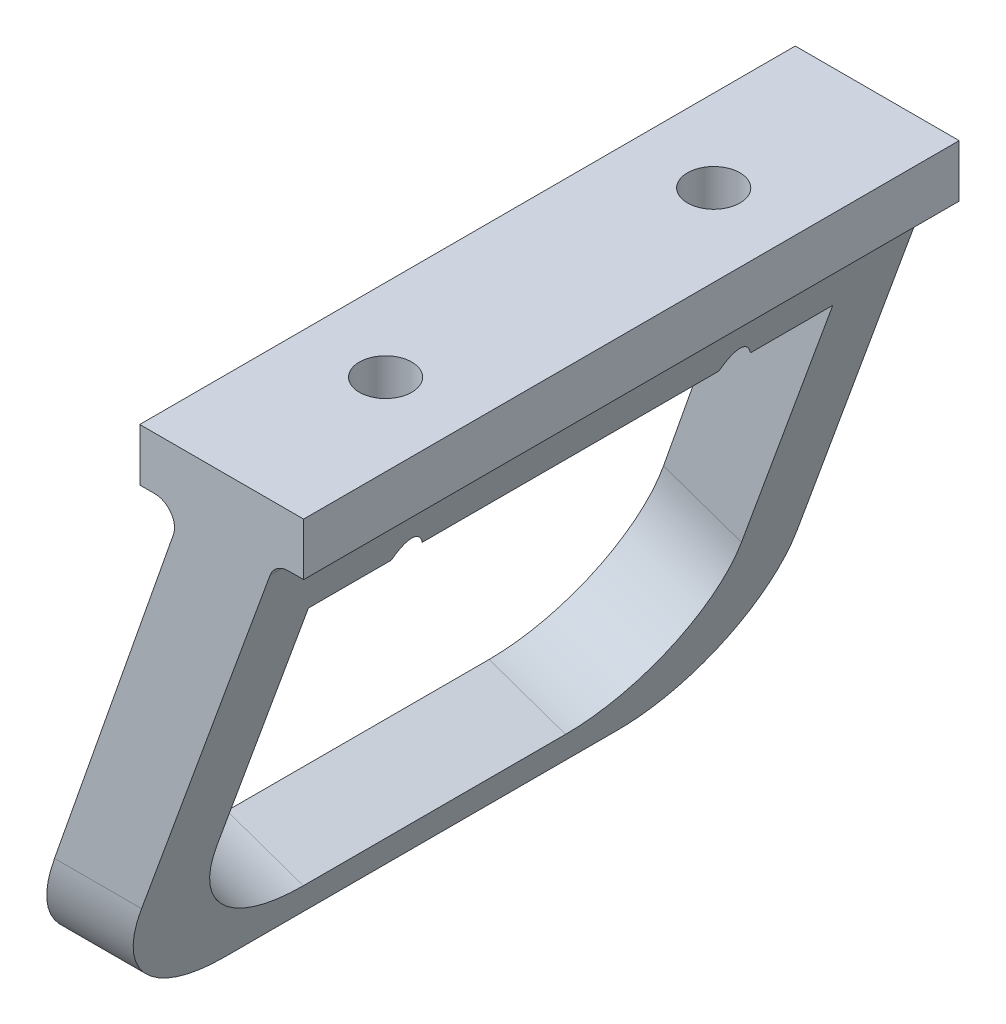
ISO-10303-21;
HEADER;
FILE_DESCRIPTION(('STEP AP214'),'2;1');
FILE_NAME('part.step','',(''),(''),'','','');
FILE_SCHEMA(('AUTOMOTIVE_DESIGN { 1 0 10303 214 1 1 1 1 }'));
ENDSEC;
DATA;
#1=APPLICATION_CONTEXT('core data for automotive mechanical design processes');
#2=APPLICATION_PROTOCOL_DEFINITION('international standard','automotive_design',2000,#1);
#3=PRODUCT_CONTEXT('',#1,'mechanical');
#4=PRODUCT('Part','Part','',(#3));
#5=PRODUCT_RELATED_PRODUCT_CATEGORY('part','',(#4));
#6=PRODUCT_DEFINITION_FORMATION('','',#4);
#7=PRODUCT_DEFINITION_CONTEXT('part definition',#1,'design');
#8=PRODUCT_DEFINITION('design','',#6,#7);
#9=PRODUCT_DEFINITION_SHAPE('','',#8);
#10=(LENGTH_UNIT() NAMED_UNIT(*) SI_UNIT(.MILLI.,.METRE.));
#11=(NAMED_UNIT(*) PLANE_ANGLE_UNIT() SI_UNIT($,.RADIAN.));
#12=(NAMED_UNIT(*) SI_UNIT($,.STERADIAN.) SOLID_ANGLE_UNIT());
#13=UNCERTAINTY_MEASURE_WITH_UNIT(LENGTH_MEASURE(1.E-05),#10,'distance_accuracy_value','');
#14=(GEOMETRIC_REPRESENTATION_CONTEXT(3) GLOBAL_UNCERTAINTY_ASSIGNED_CONTEXT((#13)) GLOBAL_UNIT_ASSIGNED_CONTEXT((#10,
#11,#12)) REPRESENTATION_CONTEXT('',''));
#15=CARTESIAN_POINT('',(0.,0.,0.));
#16=DIRECTION('',(0.,0.,1.));
#17=DIRECTION('',(1.,0.,0.));
#18=AXIS2_PLACEMENT_3D('',#15,#16,#17);
#19=CARTESIAN_POINT('',(-20.,-75.8286661573129,-100.));
#20=DIRECTION('',(0.943905830464153,-0.330214753177047,0.));
#21=DIRECTION('',(0.330214753177047,0.943905830464153,0.));
#22=AXIS2_PLACEMENT_3D('',#19,#20,#21);
#23=PLANE('',#22);
#24=DIRECTION('',(0.,0.,1.));
#25=VECTOR('',#24,1.);
#26=CARTESIAN_POINT('',(-20.,-75.8286661573129,-100.));
#27=LINE('',#26,#25);
#28=CARTESIAN_POINT('',(-20.,-75.8286661573129,-80.));
#29=VERTEX_POINT('',#28);
#30=CARTESIAN_POINT('',(-20.,-75.8286661573129,-20.));
#31=VERTEX_POINT('',#30);
#32=EDGE_CURVE('E264',#29,#31,#27,.T.);
#33=ORIENTED_EDGE('',*,*,#32,.T.);
#34=CARTESIAN_POINT('',(-13.003226751663,-55.8286661573129,-20.));
#35=DIRECTION('',(0.943905830464153,-0.330214753177047,0.));
#36=DIRECTION('',(0.330214753177047,0.943905830464153,0.));
#37=AXIS2_PLACEMENT_3D('',#34,#35,#36);
#38=ELLIPSE('',#37,21.1885543605184,20.);
#39=CARTESIAN_POINT('',(-13.003226751663,-55.8286661573129,0.));
#40=VERTEX_POINT('',#39);
#41=EDGE_CURVE('E281',#31,#40,#38,.F.);
#42=ORIENTED_EDGE('',*,*,#41,.T.);
#43=DIRECTION('',(0.330214753177047,0.943905830464153,0.));
#44=VECTOR('',#43,1.);
#45=CARTESIAN_POINT('',(-20.,-75.8286661573129,0.));
#46=LINE('',#45,#44);
#47=CARTESIAN_POINT('',(5.13171749139246,-3.99064425953114,0.));
#48=VERTEX_POINT('',#47);
#49=EDGE_CURVE('E235',#40,#48,#46,.T.);
#50=ORIENTED_EDGE('',*,*,#49,.T.);
#51=DIRECTION('',(0.,0.,1.));
#52=VECTOR('',#51,1.);
#53=CARTESIAN_POINT('',(5.13171749139246,-3.99064425953114,-100.));
#54=LINE('',#53,#52);
#55=CARTESIAN_POINT('',(5.13171749139246,-3.99064425953114,-100.));
#56=VERTEX_POINT('',#55);
#57=EDGE_CURVE('E265',#56,#48,#54,.T.);
#58=ORIENTED_EDGE('',*,*,#57,.F.);
#59=DIRECTION('',(0.330214753177047,0.943905830464153,0.));
#60=VECTOR('',#59,1.);
#61=CARTESIAN_POINT('',(-20.,-75.8286661573129,-100.));
#62=LINE('',#61,#60);
#63=CARTESIAN_POINT('',(-13.003226751663,-55.8286661573129,-100.));
#64=VERTEX_POINT('',#63);
#65=EDGE_CURVE('E214',#64,#56,#62,.T.);
#66=ORIENTED_EDGE('',*,*,#65,.F.);
#67=CARTESIAN_POINT('',(-13.003226751663,-55.8286661573129,-80.));
#68=DIRECTION('',(0.943905830464153,-0.330214753177047,0.));
#69=DIRECTION('',(-0.330214753177047,-0.943905830464153,0.));
#70=AXIS2_PLACEMENT_3D('',#67,#68,#69);
#71=ELLIPSE('',#70,21.1885543605184,20.);
#72=EDGE_CURVE('E276',#64,#29,#71,.F.);
#73=ORIENTED_EDGE('',*,*,#72,.T.);
#74=EDGE_LOOP('',(#33,#42,#50,#58,#66,#73));
#75=FACE_BOUND('',#74,.T.);
#76=CARTESIAN_POINT('',(-10.0935574046886,-47.5114912433883,-70.));
#77=DIRECTION('',(-0.943905830464153,0.330214753177047,0.));
#78=DIRECTION('',(-0.330214753177047,-0.943905830464153,0.));
#79=AXIS2_PLACEMENT_3D('',#76,#77,#78);
#80=CIRCLE('',#79,20.);
#81=CARTESIAN_POINT('',(-10.0935574046885,-47.5114912433882,-90.));
#82=VERTEX_POINT('',#81);
#83=CARTESIAN_POINT('',(-16.6978524682295,-66.3896078526714,-69.9999999999998));
#84=VERTEX_POINT('',#83);
#85=EDGE_CURVE('E296',#82,#84,#80,.T.);
#86=ORIENTED_EDGE('',*,*,#85,.F.);
#87=DIRECTION('',(-0.330214753177047,-0.943905830464153,0.));
#88=VECTOR('',#87,1.);
#89=CARTESIAN_POINT('',(3.35630803146053,-9.06558208277391,-90.));
#90=LINE('',#89,#88);
#91=CARTESIAN_POINT('',(3.35630803146053,-9.06558208277391,-90.));
#92=VERTEX_POINT('',#91);
#93=EDGE_CURVE('E291',#92,#82,#90,.T.);
#94=ORIENTED_EDGE('',*,*,#93,.F.);
#95=DIRECTION('',(0.,0.,-1.));
#96=VECTOR('',#95,1.);
#97=CARTESIAN_POINT('',(3.35630803146053,-9.06558208277391,-90.));
#98=LINE('',#97,#96);
#99=CARTESIAN_POINT('',(3.35630803146053,-9.06558208277391,-10.));
#100=VERTEX_POINT('',#99);
#101=EDGE_CURVE('E313',#100,#92,#98,.T.);
#102=ORIENTED_EDGE('',*,*,#101,.F.);
#103=DIRECTION('',(0.330214753177047,0.943905830464153,0.));
#104=VECTOR('',#103,1.);
#105=CARTESIAN_POINT('',(3.35630803146053,-9.06558208277391,-10.));
#106=LINE('',#105,#104);
#107=CARTESIAN_POINT('',(-10.0935574046885,-47.5114912433882,-9.99999999999999));
#108=VERTEX_POINT('',#107);
#109=EDGE_CURVE('E306',#108,#100,#106,.T.);
#110=ORIENTED_EDGE('',*,*,#109,.F.);
#111=CARTESIAN_POINT('',(-10.0935574046886,-47.5114912433883,-30.));
#112=DIRECTION('',(-0.943905830464153,0.330214753177047,0.));
#113=DIRECTION('',(-0.330214753177047,-0.943905830464153,0.));
#114=AXIS2_PLACEMENT_3D('',#111,#112,#113);
#115=CIRCLE('',#114,20.);
#116=CARTESIAN_POINT('',(-16.6978524682295,-66.3896078526714,-30.0000000000001));
#117=VERTEX_POINT('',#116);
#118=EDGE_CURVE('E304',#117,#108,#115,.T.);
#119=ORIENTED_EDGE('',*,*,#118,.F.);
#120=DIRECTION('',(0.,0.,1.));
#121=VECTOR('',#120,1.);
#122=CARTESIAN_POINT('',(-16.6978524682295,-66.3896078526714,-69.9999999999998));
#123=LINE('',#122,#121);
#124=EDGE_CURVE('E305',#84,#117,#123,.T.);
#125=ORIENTED_EDGE('',*,*,#124,.F.);
#126=EDGE_LOOP('',(#86,#94,#102,#110,#119,#125));
#127=FACE_BOUND('',#126,.T.);
#128=ADVANCED_FACE('F41',(#75,#127),#23,.F.);
#129=CARTESIAN_POINT('',(22.7,-3.00000000000001,-100.));
#130=DIRECTION('',(0.,0.,1.));
#131=DIRECTION('',(1.,0.,0.));
#132=AXIS2_PLACEMENT_3D('',#129,#130,#131);
#133=CYLINDRICAL_SURFACE('',#132,3.);
#134=CARTESIAN_POINT('',(22.7,-3.00000000000001,0.));
#135=DIRECTION('',(0.,0.,1.));
#136=DIRECTION('',(1.,0.,0.));
#137=AXIS2_PLACEMENT_3D('',#134,#135,#136);
#138=CIRCLE('',#137,3.);
#139=CARTESIAN_POINT('',(22.7,0.,0.));
#140=VERTEX_POINT('',#139);
#141=CARTESIAN_POINT('',(19.8809221376423,-1.973939570023,0.));
#142=VERTEX_POINT('',#141);
#143=EDGE_CURVE('E205',#140,#142,#138,.T.);
#144=ORIENTED_EDGE('',*,*,#143,.T.);
#145=DIRECTION('',(0.,0.,1.));
#146=VECTOR('',#145,1.);
#147=CARTESIAN_POINT('',(19.8809221376423,-1.973939570023,-100.));
#148=LINE('',#147,#146);
#149=CARTESIAN_POINT('',(19.8809221376423,-1.973939570023,-100.));
#150=VERTEX_POINT('',#149);
#151=EDGE_CURVE('E271',#150,#142,#148,.T.);
#152=ORIENTED_EDGE('',*,*,#151,.F.);
#153=CARTESIAN_POINT('',(22.7,-3.00000000000001,-100.));
#154=DIRECTION('',(0.,0.,1.));
#155=DIRECTION('',(1.,0.,0.));
#156=AXIS2_PLACEMENT_3D('',#153,#154,#155);
#157=CIRCLE('',#156,3.);
#158=CARTESIAN_POINT('',(22.7,0.,-100.));
#159=VERTEX_POINT('',#158);
#160=EDGE_CURVE('E208',#159,#150,#157,.T.);
#161=ORIENTED_EDGE('',*,*,#160,.F.);
#162=DIRECTION('',(0.,0.,1.));
#163=VECTOR('',#162,1.);
#164=CARTESIAN_POINT('',(22.7,0.,-100.));
#165=LINE('',#164,#163);
#166=EDGE_CURVE('E227',#159,#140,#165,.T.);
#167=ORIENTED_EDGE('',*,*,#166,.T.);
#168=EDGE_LOOP('',(#144,#152,#161,#167));
#169=FACE_BOUND('',#168,.T.);
#170=ADVANCED_FACE('F361',(#169),#133,.F.);
#171=CARTESIAN_POINT('',(19.8809221376423,-1.973939570023,-100.));
#172=DIRECTION('',(-0.939692620785908,0.342020143325669,0.));
#173=DIRECTION('',(-0.342020143325669,-0.939692620785908,0.));
#174=AXIS2_PLACEMENT_3D('',#171,#172,#173);
#175=PLANE('',#174);
#176=DIRECTION('',(0.,0.,-1.));
#177=VECTOR('',#176,1.);
#178=CARTESIAN_POINT('',(15.724875073555,-13.3925850327934,-100.));
#179=LINE('',#178,#177);
#180=CARTESIAN_POINT('',(15.724875073555,-13.3925850327934,-27.3664701054447));
#181=VERTEX_POINT('',#180);
#182=CARTESIAN_POINT('',(15.724875073555,-13.3925850327934,-72.6330569188655));
#183=VERTEX_POINT('',#182);
#184=EDGE_CURVE('E183',#181,#183,#179,.T.);
#185=ORIENTED_EDGE('',*,*,#184,.T.);
#186=CARTESIAN_POINT('',(12.5250534100587,-22.1840227995312,-75.0332946824672));
#187=DIRECTION('',(-0.939692620785908,0.342020143325669,0.));
#188=DIRECTION('',(0.342020143325669,0.939692620785908,0.));
#189=AXIS2_PLACEMENT_3D('',#186,#187,#188);
#190=ELLIPSE('',#189,11.6952176006523,3.99999999999999);
#191=CARTESIAN_POINT('',(15.724875073555,-13.3925850327934,-77.4335324460689));
#192=VERTEX_POINT('',#191);
#193=EDGE_CURVE('E54',#183,#192,#190,.T.);
#194=ORIENTED_EDGE('',*,*,#193,.T.);
#195=CARTESIAN_POINT('',(15.724875073555,-13.3925850327934,-90.));
#196=VERTEX_POINT('',#195);
#197=EDGE_CURVE('E181',#192,#196,#179,.T.);
#198=ORIENTED_EDGE('',*,*,#197,.T.);
#199=DIRECTION('',(-0.342020143325669,-0.939692620785908,0.));
#200=VECTOR('',#199,1.);
#201=CARTESIAN_POINT('',(19.8809221376423,-1.973939570023,-90.));
#202=LINE('',#201,#200);
#203=CARTESIAN_POINT('',(1.79307381276462,-51.6698944091444,-90.));
#204=VERTEX_POINT('',#203);
#205=EDGE_CURVE('E203',#196,#204,#202,.T.);
#206=ORIENTED_EDGE('',*,*,#205,.T.);
#207=CARTESIAN_POINT('',(1.79307381276457,-51.6698944091445,-70.));
#208=DIRECTION('',(-0.939692620785908,0.342020143325669,0.));
#209=DIRECTION('',(-0.342020143325669,-0.939692620785908,0.));
#210=AXIS2_PLACEMENT_3D('',#207,#208,#209);
#211=ELLIPSE('',#210,20.0015713071641,20.);
#212=CARTESIAN_POINT('',(-5.04786647245031,-70.4652233706098,-69.9999999999998));
#213=VERTEX_POINT('',#212);
#214=EDGE_CURVE('E312',#204,#213,#211,.T.);
#215=ORIENTED_EDGE('',*,*,#214,.T.);
#216=DIRECTION('',(0.,0.,1.));
#217=VECTOR('',#216,1.);
#218=CARTESIAN_POINT('',(-5.04786647245031,-70.4652233706098,-100.));
#219=LINE('',#218,#217);
#220=CARTESIAN_POINT('',(-5.04786647245031,-70.4652233706098,-30.0000000000001));
#221=VERTEX_POINT('',#220);
#222=EDGE_CURVE('E330',#213,#221,#219,.T.);
#223=ORIENTED_EDGE('',*,*,#222,.T.);
#224=CARTESIAN_POINT('',(1.79307381276456,-51.6698944091445,-30.));
#225=DIRECTION('',(-0.939692620785908,0.342020143325669,0.));
#226=DIRECTION('',(-0.342020143325669,-0.939692620785908,0.));
#227=AXIS2_PLACEMENT_3D('',#224,#225,#226);
#228=ELLIPSE('',#227,20.0015713071641,20.);
#229=CARTESIAN_POINT('',(1.79307381276462,-51.6698944091444,-9.99999999999999));
#230=VERTEX_POINT('',#229);
#231=EDGE_CURVE('E197',#221,#230,#228,.T.);
#232=ORIENTED_EDGE('',*,*,#231,.T.);
#233=DIRECTION('',(0.342020143325669,0.939692620785908,0.));
#234=VECTOR('',#233,1.);
#235=CARTESIAN_POINT('',(19.8809221376423,-1.97393957002296,-10.));
#236=LINE('',#235,#234);
#237=CARTESIAN_POINT('',(15.724875073555,-13.3925850327934,-10.));
#238=VERTEX_POINT('',#237);
#239=EDGE_CURVE('E193',#230,#238,#236,.T.);
#240=ORIENTED_EDGE('',*,*,#239,.T.);
#241=CARTESIAN_POINT('',(15.724875073555,-13.3925850327934,-22.6335298945553));
#242=VERTEX_POINT('',#241);
#243=EDGE_CURVE('E194',#238,#242,#179,.T.);
#244=ORIENTED_EDGE('',*,*,#243,.T.);
#245=CARTESIAN_POINT('',(12.5,-22.2528564779478,-25.));
#246=DIRECTION('',(-0.939692620785908,0.342020143325669,0.));
#247=DIRECTION('',(0.342020143325669,0.939692620785908,0.));
#248=AXIS2_PLACEMENT_3D('',#245,#246,#247);
#249=ELLIPSE('',#248,11.6952176006523,3.99999999999999);
#250=EDGE_CURVE('E61',#242,#181,#249,.T.);
#251=ORIENTED_EDGE('',*,*,#250,.T.);
#252=EDGE_LOOP('',(#185,#194,#198,#206,#215,#223,#232,#240,#244,#251));
#253=FACE_BOUND('',#252,.T.);
#254=DIRECTION('',(-0.342020143325669,-0.939692620785908,0.));
#255=VECTOR('',#254,1.);
#256=CARTESIAN_POINT('',(19.8809221376423,-1.973939570023,0.));
#257=LINE('',#256,#255);
#258=CARTESIAN_POINT('',(0.279404685324062,-55.8286661573129,0.));
#259=VERTEX_POINT('',#258);
#260=EDGE_CURVE('E202',#142,#259,#257,.T.);
#261=ORIENTED_EDGE('',*,*,#260,.T.);
#262=CARTESIAN_POINT('',(0.279404685324062,-55.8286661573129,-20.));
#263=DIRECTION('',(-0.939692620785908,0.342020143325669,0.));
#264=DIRECTION('',(0.342020143325669,0.939692620785908,0.));
#265=AXIS2_PLACEMENT_3D('',#262,#263,#264);
#266=ELLIPSE('',#265,21.2835554495182,20.);
#267=CARTESIAN_POINT('',(-6.99999999999999,-75.8286661573129,-20.));
#268=VERTEX_POINT('',#267);
#269=EDGE_CURVE('E290',#259,#268,#266,.F.);
#270=ORIENTED_EDGE('',*,*,#269,.T.);
#271=DIRECTION('',(0.,0.,1.));
#272=VECTOR('',#271,1.);
#273=CARTESIAN_POINT('',(-6.99999999999999,-75.8286661573129,-100.));
#274=LINE('',#273,#272);
#275=CARTESIAN_POINT('',(-6.99999999999999,-75.8286661573129,-80.));
#276=VERTEX_POINT('',#275);
#277=EDGE_CURVE('E268',#276,#268,#274,.T.);
#278=ORIENTED_EDGE('',*,*,#277,.F.);
#279=CARTESIAN_POINT('',(0.279404685324062,-55.8286661573129,-80.));
#280=DIRECTION('',(-0.939692620785908,0.342020143325669,0.));
#281=DIRECTION('',(-0.342020143325669,-0.939692620785908,0.));
#282=AXIS2_PLACEMENT_3D('',#279,#280,#281);
#283=ELLIPSE('',#282,21.2835554495182,20.);
#284=CARTESIAN_POINT('',(0.279404685324062,-55.8286661573129,-100.));
#285=VERTEX_POINT('',#284);
#286=EDGE_CURVE('E284',#276,#285,#283,.F.);
#287=ORIENTED_EDGE('',*,*,#286,.T.);
#288=DIRECTION('',(-0.342020143325669,-0.939692620785908,0.));
#289=VECTOR('',#288,1.);
#290=CARTESIAN_POINT('',(19.8809221376423,-1.973939570023,-100.));
#291=LINE('',#290,#289);
#292=EDGE_CURVE('E211',#150,#285,#291,.T.);
#293=ORIENTED_EDGE('',*,*,#292,.F.);
#294=ORIENTED_EDGE('',*,*,#151,.T.);
#295=EDGE_LOOP('',(#261,#270,#278,#287,#293,#294));
#296=FACE_BOUND('',#295,.T.);
#297=ADVANCED_FACE('F179',(#253,#296),#175,.F.);
#298=CARTESIAN_POINT('',(-6.99999999999999,-75.8286661573129,-100.));
#299=DIRECTION('',(0.,1.,0.));
#300=DIRECTION('',(0.,0.,1.));
#301=AXIS2_PLACEMENT_3D('',#298,#299,#300);
#302=PLANE('',#301);
#303=ORIENTED_EDGE('',*,*,#277,.T.);
#304=DIRECTION('',(-1.,0.,0.));
#305=VECTOR('',#304,1.);
#306=CARTESIAN_POINT('',(-20.,-75.8286661573129,-20.));
#307=LINE('',#306,#305);
#308=EDGE_CURVE('E277',#268,#31,#307,.T.);
#309=ORIENTED_EDGE('',*,*,#308,.T.);
#310=ORIENTED_EDGE('',*,*,#32,.F.);
#311=DIRECTION('',(-1.,0.,0.));
#312=VECTOR('',#311,1.);
#313=CARTESIAN_POINT('',(-6.99999999999999,-75.8286661573129,-80.));
#314=LINE('',#313,#312);
#315=EDGE_CURVE('E273',#29,#276,#314,.F.);
#316=ORIENTED_EDGE('',*,*,#315,.T.);
#317=EDGE_LOOP('',(#303,#309,#310,#316));
#318=FACE_BOUND('',#317,.T.);
#319=ADVANCED_FACE('F376',(#318),#302,.F.);
#320=CARTESIAN_POINT('',(2.3,-3.,-100.));
#321=DIRECTION('',(0.,0.,1.));
#322=DIRECTION('',(1.,0.,0.));
#323=AXIS2_PLACEMENT_3D('',#320,#321,#322);
#324=CYLINDRICAL_SURFACE('',#323,3.);
#325=CARTESIAN_POINT('',(2.3,-3.,0.));
#326=DIRECTION('',(0.,0.,1.));
#327=DIRECTION('',(1.,0.,0.));
#328=AXIS2_PLACEMENT_3D('',#325,#326,#327);
#329=CIRCLE('',#328,3.);
#330=CARTESIAN_POINT('',(2.3,0.,0.));
#331=VERTEX_POINT('',#330);
#332=EDGE_CURVE('E232',#48,#331,#329,.T.);
#333=ORIENTED_EDGE('',*,*,#332,.T.);
#334=DIRECTION('',(0.,0.,1.));
#335=VECTOR('',#334,1.);
#336=CARTESIAN_POINT('',(2.3,0.,-100.));
#337=LINE('',#336,#335);
#338=CARTESIAN_POINT('',(2.3,0.,-100.));
#339=VERTEX_POINT('',#338);
#340=EDGE_CURVE('E259',#339,#331,#337,.T.);
#341=ORIENTED_EDGE('',*,*,#340,.F.);
#342=CARTESIAN_POINT('',(2.3,-3.,-100.));
#343=DIRECTION('',(0.,0.,1.));
#344=DIRECTION('',(1.,0.,0.));
#345=AXIS2_PLACEMENT_3D('',#342,#343,#344);
#346=CIRCLE('',#345,3.);
#347=EDGE_CURVE('E220',#56,#339,#346,.T.);
#348=ORIENTED_EDGE('',*,*,#347,.F.);
#349=ORIENTED_EDGE('',*,*,#57,.T.);
#350=EDGE_LOOP('',(#333,#341,#348,#349));
#351=FACE_BOUND('',#350,.T.);
#352=ADVANCED_FACE('F372',(#351),#324,.F.);
#353=CARTESIAN_POINT('',(2.3,0.,-100.));
#354=DIRECTION('',(0.,1.,0.));
#355=DIRECTION('',(-1.,0.,0.));
#356=AXIS2_PLACEMENT_3D('',#353,#354,#355);
#357=PLANE('',#356);
#358=DIRECTION('',(-1.,0.,0.));
#359=VECTOR('',#358,1.);
#360=CARTESIAN_POINT('',(2.3,0.,0.));
#361=LINE('',#360,#359);
#362=CARTESIAN_POINT('',(0.,0.,0.));
#363=VERTEX_POINT('',#362);
#364=EDGE_CURVE('E237',#331,#363,#361,.T.);
#365=ORIENTED_EDGE('',*,*,#364,.T.);
#366=DIRECTION('',(0.,0.,1.));
#367=VECTOR('',#366,1.);
#368=CARTESIAN_POINT('',(0.,0.,-100.));
#369=LINE('',#368,#367);
#370=CARTESIAN_POINT('',(0.,0.,-100.));
#371=VERTEX_POINT('',#370);
#372=EDGE_CURVE('E258',#371,#363,#369,.T.);
#373=ORIENTED_EDGE('',*,*,#372,.F.);
#374=DIRECTION('',(-1.,0.,0.));
#375=VECTOR('',#374,1.);
#376=CARTESIAN_POINT('',(2.3,0.,-100.));
#377=LINE('',#376,#375);
#378=EDGE_CURVE('E218',#339,#371,#377,.T.);
#379=ORIENTED_EDGE('',*,*,#378,.F.);
#380=ORIENTED_EDGE('',*,*,#340,.T.);
#381=EDGE_LOOP('',(#365,#373,#379,#380));
#382=FACE_BOUND('',#381,.T.);
#383=ADVANCED_FACE('F512',(#382),#357,.F.);
#384=CARTESIAN_POINT('',(0.,0.,-100.));
#385=DIRECTION('',(1.,0.,0.));
#386=DIRECTION('',(0.,0.,-1.));
#387=AXIS2_PLACEMENT_3D('',#384,#385,#386);
#388=PLANE('',#387);
#389=DIRECTION('',(0.,1.,0.));
#390=VECTOR('',#389,1.);
#391=CARTESIAN_POINT('',(0.,0.,0.));
#392=LINE('',#391,#390);
#393=CARTESIAN_POINT('',(0.,8.,0.));
#394=VERTEX_POINT('',#393);
#395=EDGE_CURVE('E236',#363,#394,#392,.T.);
#396=ORIENTED_EDGE('',*,*,#395,.T.);
#397=DIRECTION('',(0.,0.,1.));
#398=VECTOR('',#397,1.);
#399=CARTESIAN_POINT('',(0.,8.,-100.));
#400=LINE('',#399,#398);
#401=CARTESIAN_POINT('',(0.,8.,-100.));
#402=VERTEX_POINT('',#401);
#403=EDGE_CURVE('E251',#402,#394,#400,.T.);
#404=ORIENTED_EDGE('',*,*,#403,.F.);
#405=DIRECTION('',(0.,1.,0.));
#406=VECTOR('',#405,1.);
#407=CARTESIAN_POINT('',(0.,0.,-100.));
#408=LINE('',#407,#406);
#409=EDGE_CURVE('E222',#371,#402,#408,.T.);
#410=ORIENTED_EDGE('',*,*,#409,.F.);
#411=ORIENTED_EDGE('',*,*,#372,.T.);
#412=EDGE_LOOP('',(#396,#404,#410,#411));
#413=FACE_BOUND('',#412,.T.);
#414=ADVANCED_FACE('F396',(#413),#388,.F.);
#415=CARTESIAN_POINT('',(0.,8.,-100.));
#416=DIRECTION('',(0.,-1.,0.));
#417=DIRECTION('',(1.,0.,0.));
#418=AXIS2_PLACEMENT_3D('',#415,#416,#417);
#419=PLANE('',#418);
#420=CARTESIAN_POINT('',(12.5250534100587,8.00000000000001,-75.0332946824672));
#421=DIRECTION('',(0.,1.,0.));
#422=DIRECTION('',(0.,0.,1.));
#423=AXIS2_PLACEMENT_3D('',#420,#421,#422);
#424=CIRCLE('',#423,3.99999999999999);
#425=CARTESIAN_POINT('',(12.5250534100587,8.00000000000001,-71.0332946824672));
#426=VERTEX_POINT('',#425);
#427=EDGE_CURVE('E190',#426,#426,#424,.T.);
#428=ORIENTED_EDGE('',*,*,#427,.F.);
#429=EDGE_LOOP('',(#428));
#430=FACE_BOUND('',#429,.T.);
#431=CARTESIAN_POINT('',(12.5,8.00000000000001,-25.));
#432=DIRECTION('',(0.,1.,0.));
#433=DIRECTION('',(0.,0.,1.));
#434=AXIS2_PLACEMENT_3D('',#431,#432,#433);
#435=CIRCLE('',#434,3.99999999999999);
#436=CARTESIAN_POINT('',(12.5,8.00000000000001,-21.));
#437=VERTEX_POINT('',#436);
#438=EDGE_CURVE('E186',#437,#437,#435,.T.);
#439=ORIENTED_EDGE('',*,*,#438,.F.);
#440=EDGE_LOOP('',(#439));
#441=FACE_BOUND('',#440,.T.);
#442=DIRECTION('',(1.,0.,0.));
#443=VECTOR('',#442,1.);
#444=CARTESIAN_POINT('',(0.,8.,0.));
#445=LINE('',#444,#443);
#446=CARTESIAN_POINT('',(25.,8.00000000000001,0.));
#447=VERTEX_POINT('',#446);
#448=EDGE_CURVE('E238',#394,#447,#445,.T.);
#449=ORIENTED_EDGE('',*,*,#448,.T.);
#450=DIRECTION('',(0.,0.,1.));
#451=VECTOR('',#450,1.);
#452=CARTESIAN_POINT('',(25.,8.00000000000001,-100.));
#453=LINE('',#452,#451);
#454=CARTESIAN_POINT('',(25.,8.00000000000001,-100.));
#455=VERTEX_POINT('',#454);
#456=EDGE_CURVE('E249',#455,#447,#453,.T.);
#457=ORIENTED_EDGE('',*,*,#456,.F.);
#458=DIRECTION('',(1.,0.,0.));
#459=VECTOR('',#458,1.);
#460=CARTESIAN_POINT('',(0.,8.,-100.));
#461=LINE('',#460,#459);
#462=EDGE_CURVE('E224',#402,#455,#461,.T.);
#463=ORIENTED_EDGE('',*,*,#462,.F.);
#464=ORIENTED_EDGE('',*,*,#403,.T.);
#465=EDGE_LOOP('',(#449,#457,#463,#464));
#466=FACE_BOUND('',#465,.T.);
#467=ADVANCED_FACE('F391',(#430,#441,#466),#419,.F.);
#468=CARTESIAN_POINT('',(25.,8.00000000000001,-100.));
#469=DIRECTION('',(-1.,0.,0.));
#470=DIRECTION('',(0.,-1.,0.));
#471=AXIS2_PLACEMENT_3D('',#468,#469,#470);
#472=PLANE('',#471);
#473=DIRECTION('',(0.,-1.,0.));
#474=VECTOR('',#473,1.);
#475=CARTESIAN_POINT('',(25.,8.00000000000001,0.));
#476=LINE('',#475,#474);
#477=CARTESIAN_POINT('',(25.,0.,0.));
#478=VERTEX_POINT('',#477);
#479=EDGE_CURVE('E245',#447,#478,#476,.T.);
#480=ORIENTED_EDGE('',*,*,#479,.T.);
#481=DIRECTION('',(0.,0.,1.));
#482=VECTOR('',#481,1.);
#483=CARTESIAN_POINT('',(25.,0.,-100.));
#484=LINE('',#483,#482);
#485=CARTESIAN_POINT('',(25.,0.,-100.));
#486=VERTEX_POINT('',#485);
#487=EDGE_CURVE('E250',#486,#478,#484,.T.);
#488=ORIENTED_EDGE('',*,*,#487,.F.);
#489=DIRECTION('',(0.,-1.,0.));
#490=VECTOR('',#489,1.);
#491=CARTESIAN_POINT('',(25.,8.00000000000001,-100.));
#492=LINE('',#491,#490);
#493=EDGE_CURVE('E223',#455,#486,#492,.T.);
#494=ORIENTED_EDGE('',*,*,#493,.F.);
#495=ORIENTED_EDGE('',*,*,#456,.T.);
#496=EDGE_LOOP('',(#480,#488,#494,#495));
#497=FACE_BOUND('',#496,.T.);
#498=ADVANCED_FACE('F394',(#497),#472,.F.);
#499=CARTESIAN_POINT('',(25.,0.,-100.));
#500=DIRECTION('',(0.,1.,0.));
#501=DIRECTION('',(-1.,0.,0.));
#502=AXIS2_PLACEMENT_3D('',#499,#500,#501);
#503=PLANE('',#502);
#504=DIRECTION('',(-1.,0.,0.));
#505=VECTOR('',#504,1.);
#506=CARTESIAN_POINT('',(25.,0.,0.));
#507=LINE('',#506,#505);
#508=EDGE_CURVE('E215',#478,#140,#507,.T.);
#509=ORIENTED_EDGE('',*,*,#508,.T.);
#510=ORIENTED_EDGE('',*,*,#166,.F.);
#511=DIRECTION('',(-1.,0.,0.));
#512=VECTOR('',#511,1.);
#513=CARTESIAN_POINT('',(25.,0.,-100.));
#514=LINE('',#513,#512);
#515=EDGE_CURVE('E230',#486,#159,#514,.T.);
#516=ORIENTED_EDGE('',*,*,#515,.F.);
#517=ORIENTED_EDGE('',*,*,#487,.T.);
#518=EDGE_LOOP('',(#509,#510,#516,#517));
#519=FACE_BOUND('',#518,.T.);
#520=ADVANCED_FACE('F490',(#519),#503,.F.);
#521=CARTESIAN_POINT('',(22.7,-3.00000000000001,-100.));
#522=DIRECTION('',(0.,0.,1.));
#523=DIRECTION('',(1.,0.,0.));
#524=AXIS2_PLACEMENT_3D('',#521,#522,#523);
#525=PLANE('',#524);
#526=ORIENTED_EDGE('',*,*,#292,.T.);
#527=DIRECTION('',(-1.,0.,0.));
#528=VECTOR('',#527,1.);
#529=CARTESIAN_POINT('',(22.7,-55.8286661573129,-100.));
#530=LINE('',#529,#528);
#531=EDGE_CURVE('E287',#285,#64,#530,.T.);
#532=ORIENTED_EDGE('',*,*,#531,.T.);
#533=ORIENTED_EDGE('',*,*,#65,.T.);
#534=ORIENTED_EDGE('',*,*,#347,.T.);
#535=ORIENTED_EDGE('',*,*,#378,.T.);
#536=ORIENTED_EDGE('',*,*,#409,.T.);
#537=ORIENTED_EDGE('',*,*,#462,.T.);
#538=ORIENTED_EDGE('',*,*,#493,.T.);
#539=ORIENTED_EDGE('',*,*,#515,.T.);
#540=ORIENTED_EDGE('',*,*,#160,.T.);
#541=EDGE_LOOP('',(#526,#532,#533,#534,#535,#536,#537,#538,#539,#540));
#542=FACE_BOUND('',#541,.T.);
#543=ADVANCED_FACE('F476',(#542),#525,.F.);
#544=CARTESIAN_POINT('',(22.7,-3.00000000000001,0.));
#545=DIRECTION('',(0.,0.,1.));
#546=DIRECTION('',(1.,0.,0.));
#547=AXIS2_PLACEMENT_3D('',#544,#545,#546);
#548=PLANE('',#547);
#549=ORIENTED_EDGE('',*,*,#49,.F.);
#550=DIRECTION('',(-1.,0.,0.));
#551=VECTOR('',#550,1.);
#552=CARTESIAN_POINT('',(-6.99999999999999,-55.8286661573129,0.));
#553=LINE('',#552,#551);
#554=EDGE_CURVE('E282',#40,#259,#553,.F.);
#555=ORIENTED_EDGE('',*,*,#554,.T.);
#556=ORIENTED_EDGE('',*,*,#260,.F.);
#557=ORIENTED_EDGE('',*,*,#143,.F.);
#558=ORIENTED_EDGE('',*,*,#508,.F.);
#559=ORIENTED_EDGE('',*,*,#479,.F.);
#560=ORIENTED_EDGE('',*,*,#448,.F.);
#561=ORIENTED_EDGE('',*,*,#395,.F.);
#562=ORIENTED_EDGE('',*,*,#364,.F.);
#563=ORIENTED_EDGE('',*,*,#332,.F.);
#564=EDGE_LOOP('',(#549,#555,#556,#557,#558,#559,#560,#561,#562,#563));
#565=FACE_BOUND('',#564,.T.);
#566=ADVANCED_FACE('F466',(#565),#548,.T.);
#567=CARTESIAN_POINT('',(43.4494277867505,-23.0917054700832,-90.));
#568=DIRECTION('',(0.,0.,-1.));
#569=DIRECTION('',(0.,1.,0.));
#570=AXIS2_PLACEMENT_3D('',#567,#568,#569);
#571=PLANE('',#570);
#572=DIRECTION('',(-0.943905830464153,0.330214753177047,0.));
#573=VECTOR('',#572,1.);
#574=CARTESIAN_POINT('',(43.4494277867505,-23.0917054700832,-90.));
#575=LINE('',#574,#573);
#576=EDGE_CURVE('E195',#196,#92,#575,.T.);
#577=ORIENTED_EDGE('',*,*,#576,.T.);
#578=ORIENTED_EDGE('',*,*,#93,.T.);
#579=DIRECTION('',(-0.943905830464153,0.330214753177047,0.));
#580=VECTOR('',#579,1.);
#581=CARTESIAN_POINT('',(29.9995623506014,-61.5376146306975,-90.));
#582=LINE('',#581,#580);
#583=EDGE_CURVE('E311',#204,#82,#582,.T.);
#584=ORIENTED_EDGE('',*,*,#583,.F.);
#585=ORIENTED_EDGE('',*,*,#205,.F.);
#586=EDGE_LOOP('',(#577,#578,#584,#585));
#587=FACE_BOUND('',#586,.T.);
#588=ADVANCED_FACE('F349',(#587),#571,.F.);
#589=CARTESIAN_POINT('',(43.4494277867505,-23.0917054700832,-90.));
#590=DIRECTION('',(0.330214753177047,0.943905830464153,0.));
#591=DIRECTION('',(-0.943905830464153,0.330214753177047,0.));
#592=AXIS2_PLACEMENT_3D('',#589,#590,#591);
#593=PLANE('',#592);
#594=ORIENTED_EDGE('',*,*,#197,.F.);
#595=CARTESIAN_POINT('',(12.5250534100587,-12.2731637020634,-75.0332946824672));
#596=DIRECTION('',(0.330214753177047,0.943905830464153,0.));
#597=DIRECTION('',(-0.943905830464153,0.330214753177047,0.));
#598=AXIS2_PLACEMENT_3D('',#595,#596,#597);
#599=ELLIPSE('',#598,4.23771087210367,3.99999999999999);
#600=EDGE_CURVE('E11',#192,#183,#599,.T.);
#601=ORIENTED_EDGE('',*,*,#600,.T.);
#602=ORIENTED_EDGE('',*,*,#184,.F.);
#603=CARTESIAN_POINT('',(12.5,-12.2643990505995,-25.));
#604=DIRECTION('',(0.330214753177047,0.943905830464153,0.));
#605=DIRECTION('',(-0.943905830464153,0.330214753177047,0.));
#606=AXIS2_PLACEMENT_3D('',#603,#604,#605);
#607=ELLIPSE('',#606,4.23771087210367,3.99999999999999);
#608=EDGE_CURVE('E47',#181,#242,#607,.T.);
#609=ORIENTED_EDGE('',*,*,#608,.T.);
#610=ORIENTED_EDGE('',*,*,#243,.F.);
#611=DIRECTION('',(-0.943905830464153,0.330214753177047,0.));
#612=VECTOR('',#611,1.);
#613=CARTESIAN_POINT('',(43.4494277867505,-23.0917054700832,-10.));
#614=LINE('',#613,#612);
#615=EDGE_CURVE('E316',#238,#100,#614,.T.);
#616=ORIENTED_EDGE('',*,*,#615,.T.);
#617=ORIENTED_EDGE('',*,*,#101,.T.);
#618=ORIENTED_EDGE('',*,*,#576,.F.);
#619=EDGE_LOOP('',(#594,#601,#602,#609,#610,#616,#617,#618));
#620=FACE_BOUND('',#619,.T.);
#621=ADVANCED_FACE('F189',(#620),#593,.F.);
#622=CARTESIAN_POINT('',(43.4494277867505,-23.0917054700832,-10.));
#623=DIRECTION('',(0.,0.,1.));
#624=DIRECTION('',(0.,-1.,0.));
#625=AXIS2_PLACEMENT_3D('',#622,#623,#624);
#626=PLANE('',#625);
#627=DIRECTION('',(-0.943905830464153,0.330214753177047,0.));
#628=VECTOR('',#627,1.);
#629=CARTESIAN_POINT('',(29.9995623506014,-61.5376146306975,-9.99999999999999));
#630=LINE('',#629,#628);
#631=EDGE_CURVE('E318',#230,#108,#630,.T.);
#632=ORIENTED_EDGE('',*,*,#631,.T.);
#633=ORIENTED_EDGE('',*,*,#109,.T.);
#634=ORIENTED_EDGE('',*,*,#615,.F.);
#635=ORIENTED_EDGE('',*,*,#239,.F.);
#636=EDGE_LOOP('',(#632,#633,#634,#635));
#637=FACE_BOUND('',#636,.T.);
#638=ADVANCED_FACE('F347',(#637),#626,.F.);
#639=CARTESIAN_POINT('',(29.9995623506014,-61.5376146306976,-30.));
#640=DIRECTION('',(-0.943905830464153,0.330214753177047,0.));
#641=DIRECTION('',(-0.330214753177047,-0.943905830464153,0.));
#642=AXIS2_PLACEMENT_3D('',#639,#640,#641);
#643=CYLINDRICAL_SURFACE('',#642,20.);
#644=DIRECTION('',(-0.943905830464153,0.330214753177047,0.));
#645=VECTOR('',#644,1.);
#646=CARTESIAN_POINT('',(23.3952672870605,-80.4157312399807,-30.0000000000001));
#647=LINE('',#646,#645);
#648=EDGE_CURVE('E319',#221,#117,#647,.T.);
#649=ORIENTED_EDGE('',*,*,#648,.T.);
#650=ORIENTED_EDGE('',*,*,#118,.T.);
#651=ORIENTED_EDGE('',*,*,#631,.F.);
#652=ORIENTED_EDGE('',*,*,#231,.F.);
#653=EDGE_LOOP('',(#649,#650,#651,#652));
#654=FACE_BOUND('',#653,.T.);
#655=ADVANCED_FACE('F333',(#654),#643,.F.);
#656=CARTESIAN_POINT('',(23.3952672870605,-80.4157312399807,-69.9999999999998));
#657=DIRECTION('',(-0.330214753177047,-0.943905830464153,0.));
#658=DIRECTION('',(0.943905830464153,-0.330214753177047,0.));
#659=AXIS2_PLACEMENT_3D('',#656,#657,#658);
#660=PLANE('',#659);
#661=DIRECTION('',(-0.943905830464153,0.330214753177047,0.));
#662=VECTOR('',#661,1.);
#663=CARTESIAN_POINT('',(23.3952672870605,-80.4157312399807,-69.9999999999998));
#664=LINE('',#663,#662);
#665=EDGE_CURVE('E325',#213,#84,#664,.T.);
#666=ORIENTED_EDGE('',*,*,#665,.T.);
#667=ORIENTED_EDGE('',*,*,#124,.T.);
#668=ORIENTED_EDGE('',*,*,#648,.F.);
#669=ORIENTED_EDGE('',*,*,#222,.F.);
#670=EDGE_LOOP('',(#666,#667,#668,#669));
#671=FACE_BOUND('',#670,.T.);
#672=ADVANCED_FACE('F340',(#671),#660,.F.);
#673=CARTESIAN_POINT('',(29.9995623506014,-61.5376146306976,-70.));
#674=DIRECTION('',(-0.943905830464153,0.330214753177047,0.));
#675=DIRECTION('',(-0.330214753177047,-0.943905830464153,0.));
#676=AXIS2_PLACEMENT_3D('',#673,#674,#675);
#677=CYLINDRICAL_SURFACE('',#676,20.);
#678=ORIENTED_EDGE('',*,*,#583,.T.);
#679=ORIENTED_EDGE('',*,*,#85,.T.);
#680=ORIENTED_EDGE('',*,*,#665,.F.);
#681=ORIENTED_EDGE('',*,*,#214,.F.);
#682=EDGE_LOOP('',(#678,#679,#680,#681));
#683=FACE_BOUND('',#682,.T.);
#684=ADVANCED_FACE('F351',(#683),#677,.F.);
#685=CARTESIAN_POINT('',(-6.99999999999999,-55.8286661573129,-20.));
#686=DIRECTION('',(1.,0.,0.));
#687=DIRECTION('',(0.,0.,-1.));
#688=AXIS2_PLACEMENT_3D('',#685,#686,#687);
#689=CYLINDRICAL_SURFACE('',#688,20.);
#690=ORIENTED_EDGE('',*,*,#269,.F.);
#691=ORIENTED_EDGE('',*,*,#554,.F.);
#692=ORIENTED_EDGE('',*,*,#41,.F.);
#693=ORIENTED_EDGE('',*,*,#308,.F.);
#694=EDGE_LOOP('',(#690,#691,#692,#693));
#695=FACE_BOUND('',#694,.T.);
#696=ADVANCED_FACE('F352',(#695),#689,.T.);
#697=CARTESIAN_POINT('',(22.7,-55.8286661573129,-80.));
#698=DIRECTION('',(-1.,0.,0.));
#699=DIRECTION('',(0.,0.,1.));
#700=AXIS2_PLACEMENT_3D('',#697,#698,#699);
#701=CYLINDRICAL_SURFACE('',#700,20.);
#702=ORIENTED_EDGE('',*,*,#286,.F.);
#703=ORIENTED_EDGE('',*,*,#315,.F.);
#704=ORIENTED_EDGE('',*,*,#72,.F.);
#705=ORIENTED_EDGE('',*,*,#531,.F.);
#706=EDGE_LOOP('',(#702,#703,#704,#705));
#707=FACE_BOUND('',#706,.T.);
#708=ADVANCED_FACE('F43',(#707),#701,.T.);
#709=CARTESIAN_POINT('',(12.5,8.00000000000001,-25.));
#710=DIRECTION('',(0.,1.,0.));
#711=DIRECTION('',(0.,0.,1.));
#712=AXIS2_PLACEMENT_3D('',#709,#710,#711);
#713=CYLINDRICAL_SURFACE('',#712,3.99999999999999);
#714=ORIENTED_EDGE('',*,*,#438,.T.);
#715=EDGE_LOOP('',(#714));
#716=FACE_BOUND('',#715,.T.);
#717=ORIENTED_EDGE('',*,*,#608,.F.);
#718=ORIENTED_EDGE('',*,*,#250,.F.);
#719=EDGE_LOOP('',(#717,#718));
#720=FACE_BOUND('',#719,.T.);
#721=ADVANCED_FACE('F295',(#716,#720),#713,.F.);
#722=CARTESIAN_POINT('',(12.5250534100587,8.00000000000001,-75.0332946824672));
#723=DIRECTION('',(0.,1.,0.));
#724=DIRECTION('',(0.,0.,1.));
#725=AXIS2_PLACEMENT_3D('',#722,#723,#724);
#726=CYLINDRICAL_SURFACE('',#725,3.99999999999999);
#727=ORIENTED_EDGE('',*,*,#427,.T.);
#728=EDGE_LOOP('',(#727));
#729=FACE_BOUND('',#728,.T.);
#730=ORIENTED_EDGE('',*,*,#600,.F.);
#731=ORIENTED_EDGE('',*,*,#193,.F.);
#732=EDGE_LOOP('',(#730,#731));
#733=FACE_BOUND('',#732,.T.);
#734=ADVANCED_FACE('F173',(#729,#733),#726,.F.);
#735=CLOSED_SHELL('',(#128,#170,#297,#319,#352,#383,#414,#467,#498,#520,#543,#566,#588,#621,
#638,#655,#672,#684,#696,#708,#721,#734));
#736=MANIFOLD_SOLID_BREP('B2',#735);
#737=ADVANCED_BREP_SHAPE_REPRESENTATION('',(#18,#736),#14);
#738=SHAPE_DEFINITION_REPRESENTATION(#9,#737);
ENDSEC;
END-ISO-10303-21;
